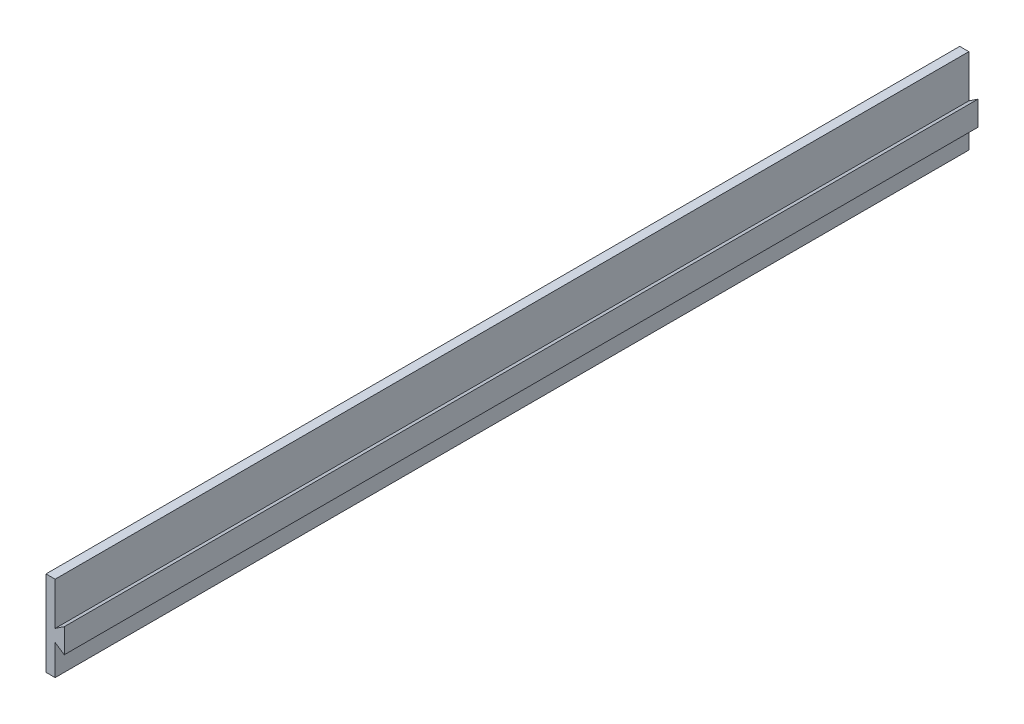
ISO-10303-21;
HEADER;
FILE_DESCRIPTION(('STEP AP214'),'2;1');
FILE_NAME('part.step','',(''),(''),'','','');
FILE_SCHEMA(('AUTOMOTIVE_DESIGN { 1 0 10303 214 1 1 1 1 }'));
ENDSEC;
DATA;
#1=APPLICATION_CONTEXT('core data for automotive mechanical design processes');
#2=APPLICATION_PROTOCOL_DEFINITION('international standard','automotive_design',2000,#1);
#3=PRODUCT_CONTEXT('',#1,'mechanical');
#4=PRODUCT('Part','Part','',(#3));
#5=PRODUCT_RELATED_PRODUCT_CATEGORY('part','',(#4));
#6=PRODUCT_DEFINITION_FORMATION('','',#4);
#7=PRODUCT_DEFINITION_CONTEXT('part definition',#1,'design');
#8=PRODUCT_DEFINITION('design','',#6,#7);
#9=PRODUCT_DEFINITION_SHAPE('','',#8);
#10=(LENGTH_UNIT() NAMED_UNIT(*) SI_UNIT(.MILLI.,.METRE.));
#11=(NAMED_UNIT(*) PLANE_ANGLE_UNIT() SI_UNIT($,.RADIAN.));
#12=(NAMED_UNIT(*) SI_UNIT($,.STERADIAN.) SOLID_ANGLE_UNIT());
#13=UNCERTAINTY_MEASURE_WITH_UNIT(LENGTH_MEASURE(1.E-05),#10,'distance_accuracy_value','');
#14=(GEOMETRIC_REPRESENTATION_CONTEXT(3) GLOBAL_UNCERTAINTY_ASSIGNED_CONTEXT((#13)) GLOBAL_UNIT_ASSIGNED_CONTEXT((#10,
#11,#12)) REPRESENTATION_CONTEXT('',''));
#15=CARTESIAN_POINT('',(0.,0.,0.));
#16=DIRECTION('',(0.,0.,1.));
#17=DIRECTION('',(1.,0.,0.));
#18=AXIS2_PLACEMENT_3D('',#15,#16,#17);
#19=CARTESIAN_POINT('',(-15.,70.,1500.));
#20=DIRECTION('',(1.,0.,0.));
#21=DIRECTION('',(0.,1.,0.));
#22=AXIS2_PLACEMENT_3D('',#19,#20,#21);
#23=PLANE('',#22);
#24=CARTESIAN_POINT('',(-15.,-60.,750.));
#25=DIRECTION('',(1.,0.,0.));
#26=DIRECTION('',(0.,1.,0.));
#27=AXIS2_PLACEMENT_3D('',#24,#25,#26);
#28=CIRCLE('',#27,3.99999999999999);
#29=CARTESIAN_POINT('',(-15.,-56.,750.));
#30=VERTEX_POINT('',#29);
#31=EDGE_CURVE('E11',#30,#30,#28,.F.);
#32=ORIENTED_EDGE('',*,*,#31,.F.);
#33=EDGE_LOOP('',(#32));
#34=FACE_BOUND('',#33,.T.);
#35=DIRECTION('',(0.,-1.,0.));
#36=VECTOR('',#35,1.);
#37=CARTESIAN_POINT('',(-15.,70.,0.));
#38=LINE('',#37,#36);
#39=CARTESIAN_POINT('',(-15.,70.,0.));
#40=VERTEX_POINT('',#39);
#41=CARTESIAN_POINT('',(-15.,-70.,0.));
#42=VERTEX_POINT('',#41);
#43=EDGE_CURVE('E141',#40,#42,#38,.T.);
#44=ORIENTED_EDGE('',*,*,#43,.T.);
#45=DIRECTION('',(0.,0.,-1.));
#46=VECTOR('',#45,1.);
#47=CARTESIAN_POINT('',(-15.,-70.,1500.));
#48=LINE('',#47,#46);
#49=CARTESIAN_POINT('',(-15.,-70.,1500.));
#50=VERTEX_POINT('',#49);
#51=EDGE_CURVE('E48',#50,#42,#48,.T.);
#52=ORIENTED_EDGE('',*,*,#51,.F.);
#53=DIRECTION('',(0.,-1.,0.));
#54=VECTOR('',#53,1.);
#55=CARTESIAN_POINT('',(-15.,70.,1500.));
#56=LINE('',#55,#54);
#57=CARTESIAN_POINT('',(-15.,70.,1500.));
#58=VERTEX_POINT('',#57);
#59=EDGE_CURVE('E164',#58,#50,#56,.T.);
#60=ORIENTED_EDGE('',*,*,#59,.F.);
#61=DIRECTION('',(0.,0.,-1.));
#62=VECTOR('',#61,1.);
#63=CARTESIAN_POINT('',(-15.,70.,1500.));
#64=LINE('',#63,#62);
#65=EDGE_CURVE('E137',#58,#40,#64,.T.);
#66=ORIENTED_EDGE('',*,*,#65,.T.);
#67=EDGE_LOOP('',(#44,#52,#60,#66));
#68=FACE_BOUND('',#67,.T.);
#69=ADVANCED_FACE('F39',(#34,#68),#23,.F.);
#70=CARTESIAN_POINT('',(-15.,-70.,1500.));
#71=DIRECTION('',(0.,1.,0.));
#72=DIRECTION('',(0.,0.,1.));
#73=AXIS2_PLACEMENT_3D('',#70,#71,#72);
#74=PLANE('',#73);
#75=DIRECTION('',(1.,0.,0.));
#76=VECTOR('',#75,1.);
#77=CARTESIAN_POINT('',(-15.,-70.,0.));
#78=LINE('',#77,#76);
#79=CARTESIAN_POINT('',(0.,-70.,0.));
#80=VERTEX_POINT('',#79);
#81=EDGE_CURVE('E145',#42,#80,#78,.T.);
#82=ORIENTED_EDGE('',*,*,#81,.T.);
#83=DIRECTION('',(0.,0.,-1.));
#84=VECTOR('',#83,1.);
#85=CARTESIAN_POINT('',(0.,-70.,1500.));
#86=LINE('',#85,#84);
#87=CARTESIAN_POINT('',(0.,-70.,1500.));
#88=VERTEX_POINT('',#87);
#89=EDGE_CURVE('E179',#88,#80,#86,.T.);
#90=ORIENTED_EDGE('',*,*,#89,.F.);
#91=DIRECTION('',(1.,0.,0.));
#92=VECTOR('',#91,1.);
#93=CARTESIAN_POINT('',(-15.,-70.,1500.));
#94=LINE('',#93,#92);
#95=EDGE_CURVE('E100',#50,#88,#94,.T.);
#96=ORIENTED_EDGE('',*,*,#95,.F.);
#97=ORIENTED_EDGE('',*,*,#51,.T.);
#98=EDGE_LOOP('',(#82,#90,#96,#97));
#99=FACE_BOUND('',#98,.T.);
#100=ADVANCED_FACE('F184',(#99),#74,.F.);
#101=CARTESIAN_POINT('',(0.,-70.,1500.));
#102=DIRECTION('',(-1.,0.,0.));
#103=DIRECTION('',(0.,-1.,0.));
#104=AXIS2_PLACEMENT_3D('',#101,#102,#103);
#105=PLANE('',#104);
#106=DIRECTION('',(0.,1.,0.));
#107=VECTOR('',#106,1.);
#108=CARTESIAN_POINT('',(0.,-70.,0.));
#109=LINE('',#108,#107);
#110=CARTESIAN_POINT('',(0.,-20.,0.));
#111=VERTEX_POINT('',#110);
#112=EDGE_CURVE('E149',#80,#111,#109,.T.);
#113=ORIENTED_EDGE('',*,*,#112,.T.);
#114=DIRECTION('',(0.,0.,-1.));
#115=VECTOR('',#114,1.);
#116=CARTESIAN_POINT('',(0.,-20.,1500.));
#117=LINE('',#116,#115);
#118=CARTESIAN_POINT('',(0.,-20.,1500.));
#119=VERTEX_POINT('',#118);
#120=EDGE_CURVE('E175',#119,#111,#117,.T.);
#121=ORIENTED_EDGE('',*,*,#120,.F.);
#122=DIRECTION('',(0.,1.,0.));
#123=VECTOR('',#122,1.);
#124=CARTESIAN_POINT('',(0.,-70.,1500.));
#125=LINE('',#124,#123);
#126=EDGE_CURVE('E203',#88,#119,#125,.T.);
#127=ORIENTED_EDGE('',*,*,#126,.F.);
#128=ORIENTED_EDGE('',*,*,#89,.T.);
#129=EDGE_LOOP('',(#113,#121,#127,#128));
#130=FACE_BOUND('',#129,.T.);
#131=ADVANCED_FACE('F195',(#130),#105,.F.);
#132=CARTESIAN_POINT('',(0.,-20.,1500.));
#133=DIRECTION('',(0.55470019622523,0.832050294337843,0.));
#134=DIRECTION('',(-0.832050294337843,0.55470019622523,0.));
#135=AXIS2_PLACEMENT_3D('',#132,#133,#134);
#136=PLANE('',#135);
#137=DIRECTION('',(0.832050294337843,-0.55470019622523,0.));
#138=VECTOR('',#137,1.);
#139=CARTESIAN_POINT('',(0.,-20.,0.));
#140=LINE('',#139,#138);
#141=CARTESIAN_POINT('',(15.,-30.,0.));
#142=VERTEX_POINT('',#141);
#143=EDGE_CURVE('E152',#111,#142,#140,.T.);
#144=ORIENTED_EDGE('',*,*,#143,.T.);
#145=DIRECTION('',(0.,0.,-1.));
#146=VECTOR('',#145,1.);
#147=CARTESIAN_POINT('',(15.,-30.,1500.));
#148=LINE('',#147,#146);
#149=CARTESIAN_POINT('',(15.,-30.,1500.));
#150=VERTEX_POINT('',#149);
#151=EDGE_CURVE('E171',#150,#142,#148,.T.);
#152=ORIENTED_EDGE('',*,*,#151,.F.);
#153=DIRECTION('',(0.832050294337843,-0.55470019622523,0.));
#154=VECTOR('',#153,1.);
#155=CARTESIAN_POINT('',(0.,-20.,1500.));
#156=LINE('',#155,#154);
#157=EDGE_CURVE('E201',#119,#150,#156,.T.);
#158=ORIENTED_EDGE('',*,*,#157,.F.);
#159=ORIENTED_EDGE('',*,*,#120,.T.);
#160=EDGE_LOOP('',(#144,#152,#158,#159));
#161=FACE_BOUND('',#160,.T.);
#162=ADVANCED_FACE('F199',(#161),#136,.F.);
#163=CARTESIAN_POINT('',(15.,9.99999999999999,1500.));
#164=DIRECTION('',(-1.,0.,0.));
#165=DIRECTION('',(0.,-1.,0.));
#166=AXIS2_PLACEMENT_3D('',#163,#164,#165);
#167=PLANE('',#166);
#168=DIRECTION('',(0.,1.,0.));
#169=VECTOR('',#168,1.);
#170=CARTESIAN_POINT('',(15.,9.99999999999999,0.));
#171=LINE('',#170,#169);
#172=CARTESIAN_POINT('',(15.,9.99999999999999,0.));
#173=VERTEX_POINT('',#172);
#174=EDGE_CURVE('E155',#142,#173,#171,.T.);
#175=ORIENTED_EDGE('',*,*,#174,.T.);
#176=DIRECTION('',(0.,0.,-1.));
#177=VECTOR('',#176,1.);
#178=CARTESIAN_POINT('',(15.,9.99999999999999,1500.));
#179=LINE('',#178,#177);
#180=CARTESIAN_POINT('',(15.,9.99999999999999,1500.));
#181=VERTEX_POINT('',#180);
#182=EDGE_CURVE('E130',#181,#173,#179,.T.);
#183=ORIENTED_EDGE('',*,*,#182,.F.);
#184=DIRECTION('',(0.,1.,0.));
#185=VECTOR('',#184,1.);
#186=CARTESIAN_POINT('',(15.,9.99999999999999,1500.));
#187=LINE('',#186,#185);
#188=EDGE_CURVE('E119',#150,#181,#187,.T.);
#189=ORIENTED_EDGE('',*,*,#188,.F.);
#190=ORIENTED_EDGE('',*,*,#151,.T.);
#191=EDGE_LOOP('',(#175,#183,#189,#190));
#192=FACE_BOUND('',#191,.T.);
#193=ADVANCED_FACE('F236',(#192),#167,.F.);
#194=CARTESIAN_POINT('',(0.,0.,1500.));
#195=DIRECTION('',(0.554700196225231,-0.832050294337842,0.));
#196=DIRECTION('',(0.832050294337843,0.554700196225231,0.));
#197=AXIS2_PLACEMENT_3D('',#194,#195,#196);
#198=PLANE('',#197);
#199=DIRECTION('',(-0.832050294337843,-0.554700196225231,0.));
#200=VECTOR('',#199,1.);
#201=CARTESIAN_POINT('',(0.,0.,0.));
#202=LINE('',#201,#200);
#203=CARTESIAN_POINT('',(0.,0.,0.));
#204=VERTEX_POINT('',#203);
#205=EDGE_CURVE('E128',#173,#204,#202,.T.);
#206=ORIENTED_EDGE('',*,*,#205,.T.);
#207=DIRECTION('',(0.,0.,-1.));
#208=VECTOR('',#207,1.);
#209=CARTESIAN_POINT('',(0.,0.,1500.));
#210=LINE('',#209,#208);
#211=CARTESIAN_POINT('',(0.,0.,1500.));
#212=VERTEX_POINT('',#211);
#213=EDGE_CURVE('E125',#212,#204,#210,.T.);
#214=ORIENTED_EDGE('',*,*,#213,.F.);
#215=DIRECTION('',(-0.832050294337843,-0.554700196225231,0.));
#216=VECTOR('',#215,1.);
#217=CARTESIAN_POINT('',(0.,0.,1500.));
#218=LINE('',#217,#216);
#219=EDGE_CURVE('E113',#181,#212,#218,.T.);
#220=ORIENTED_EDGE('',*,*,#219,.F.);
#221=ORIENTED_EDGE('',*,*,#182,.T.);
#222=EDGE_LOOP('',(#206,#214,#220,#221));
#223=FACE_BOUND('',#222,.T.);
#224=ADVANCED_FACE('F126',(#223),#198,.F.);
#225=CARTESIAN_POINT('',(0.,70.,1500.));
#226=DIRECTION('',(-1.,0.,0.));
#227=DIRECTION('',(0.,-1.,0.));
#228=AXIS2_PLACEMENT_3D('',#225,#226,#227);
#229=PLANE('',#228);
#230=DIRECTION('',(0.,1.,0.));
#231=VECTOR('',#230,1.);
#232=CARTESIAN_POINT('',(0.,70.,0.));
#233=LINE('',#232,#231);
#234=CARTESIAN_POINT('',(0.,70.,0.));
#235=VERTEX_POINT('',#234);
#236=EDGE_CURVE('E85',#204,#235,#233,.T.);
#237=ORIENTED_EDGE('',*,*,#236,.T.);
#238=DIRECTION('',(0.,0.,-1.));
#239=VECTOR('',#238,1.);
#240=CARTESIAN_POINT('',(0.,70.,1500.));
#241=LINE('',#240,#239);
#242=CARTESIAN_POINT('',(0.,70.,1500.));
#243=VERTEX_POINT('',#242);
#244=EDGE_CURVE('E131',#243,#235,#241,.T.);
#245=ORIENTED_EDGE('',*,*,#244,.F.);
#246=DIRECTION('',(0.,1.,0.));
#247=VECTOR('',#246,1.);
#248=CARTESIAN_POINT('',(0.,70.,1500.));
#249=LINE('',#248,#247);
#250=EDGE_CURVE('E117',#212,#243,#249,.T.);
#251=ORIENTED_EDGE('',*,*,#250,.F.);
#252=ORIENTED_EDGE('',*,*,#213,.T.);
#253=EDGE_LOOP('',(#237,#245,#251,#252));
#254=FACE_BOUND('',#253,.T.);
#255=ADVANCED_FACE('F133',(#254),#229,.F.);
#256=CARTESIAN_POINT('',(-15.,70.,1500.));
#257=DIRECTION('',(0.,-1.,0.));
#258=DIRECTION('',(0.,0.,-1.));
#259=AXIS2_PLACEMENT_3D('',#256,#257,#258);
#260=PLANE('',#259);
#261=DIRECTION('',(-1.,0.,0.));
#262=VECTOR('',#261,1.);
#263=CARTESIAN_POINT('',(-15.,70.,0.));
#264=LINE('',#263,#262);
#265=EDGE_CURVE('E91',#235,#40,#264,.T.);
#266=ORIENTED_EDGE('',*,*,#265,.T.);
#267=ORIENTED_EDGE('',*,*,#65,.F.);
#268=DIRECTION('',(-1.,0.,0.));
#269=VECTOR('',#268,1.);
#270=CARTESIAN_POINT('',(-15.,70.,1500.));
#271=LINE('',#270,#269);
#272=EDGE_CURVE('E56',#243,#58,#271,.T.);
#273=ORIENTED_EDGE('',*,*,#272,.F.);
#274=ORIENTED_EDGE('',*,*,#244,.T.);
#275=EDGE_LOOP('',(#266,#267,#273,#274));
#276=FACE_BOUND('',#275,.T.);
#277=ADVANCED_FACE('F244',(#276),#260,.F.);
#278=CARTESIAN_POINT('',(0.,0.,1500.));
#279=DIRECTION('',(0.,0.,1.));
#280=DIRECTION('',(1.,0.,0.));
#281=AXIS2_PLACEMENT_3D('',#278,#279,#280);
#282=PLANE('',#281);
#283=ORIENTED_EDGE('',*,*,#59,.T.);
#284=ORIENTED_EDGE('',*,*,#95,.T.);
#285=ORIENTED_EDGE('',*,*,#126,.T.);
#286=ORIENTED_EDGE('',*,*,#157,.T.);
#287=ORIENTED_EDGE('',*,*,#188,.T.);
#288=ORIENTED_EDGE('',*,*,#219,.T.);
#289=ORIENTED_EDGE('',*,*,#250,.T.);
#290=ORIENTED_EDGE('',*,*,#272,.T.);
#291=EDGE_LOOP('',(#283,#284,#285,#286,#287,#288,#289,#290));
#292=FACE_BOUND('',#291,.T.);
#293=ADVANCED_FACE('F115',(#292),#282,.T.);
#294=CARTESIAN_POINT('',(0.,0.,0.));
#295=DIRECTION('',(0.,0.,1.));
#296=DIRECTION('',(1.,0.,0.));
#297=AXIS2_PLACEMENT_3D('',#294,#295,#296);
#298=PLANE('',#297);
#299=ORIENTED_EDGE('',*,*,#43,.F.);
#300=ORIENTED_EDGE('',*,*,#265,.F.);
#301=ORIENTED_EDGE('',*,*,#236,.F.);
#302=ORIENTED_EDGE('',*,*,#205,.F.);
#303=ORIENTED_EDGE('',*,*,#174,.F.);
#304=ORIENTED_EDGE('',*,*,#143,.F.);
#305=ORIENTED_EDGE('',*,*,#112,.F.);
#306=ORIENTED_EDGE('',*,*,#81,.F.);
#307=EDGE_LOOP('',(#299,#300,#301,#302,#303,#304,#305,#306));
#308=FACE_BOUND('',#307,.T.);
#309=ADVANCED_FACE('F189',(#308),#298,.F.);
#310=CARTESIAN_POINT('',(-35.,-60.,750.));
#311=DIRECTION('',(1.,0.,0.));
#312=DIRECTION('',(0.,1.,0.));
#313=AXIS2_PLACEMENT_3D('',#310,#311,#312);
#314=CYLINDRICAL_SURFACE('',#313,3.99999999999999);
#315=CARTESIAN_POINT('',(-35.,-60.,750.));
#316=DIRECTION('',(-1.,0.,0.));
#317=DIRECTION('',(0.,-1.,0.));
#318=AXIS2_PLACEMENT_3D('',#315,#316,#317);
#319=CIRCLE('',#318,3.99999999999999);
#320=CARTESIAN_POINT('',(-35.,-64.,750.));
#321=VERTEX_POINT('',#320);
#322=EDGE_CURVE('E146',#321,#321,#319,.T.);
#323=ORIENTED_EDGE('',*,*,#322,.F.);
#324=EDGE_LOOP('',(#323));
#325=FACE_BOUND('',#324,.T.);
#326=ORIENTED_EDGE('',*,*,#31,.T.);
#327=EDGE_LOOP('',(#326));
#328=FACE_BOUND('',#327,.T.);
#329=ADVANCED_FACE('F219',(#325,#328),#314,.T.);
#330=CARTESIAN_POINT('',(-35.,-60.,750.));
#331=DIRECTION('',(-1.,0.,0.));
#332=DIRECTION('',(0.,-1.,0.));
#333=AXIS2_PLACEMENT_3D('',#330,#331,#332);
#334=PLANE('',#333);
#335=ORIENTED_EDGE('',*,*,#322,.T.);
#336=EDGE_LOOP('',(#335));
#337=FACE_BOUND('',#336,.T.);
#338=ADVANCED_FACE('F217',(#337),#334,.T.);
#339=CLOSED_SHELL('',(#69,#100,#131,#162,#193,#224,#255,#277,#293,#309,#329,#338));
#340=MANIFOLD_SOLID_BREP('B2',#339);
#341=ADVANCED_BREP_SHAPE_REPRESENTATION('',(#18,#340),#14);
#342=SHAPE_DEFINITION_REPRESENTATION(#9,#341);
ENDSEC;
END-ISO-10303-21;
